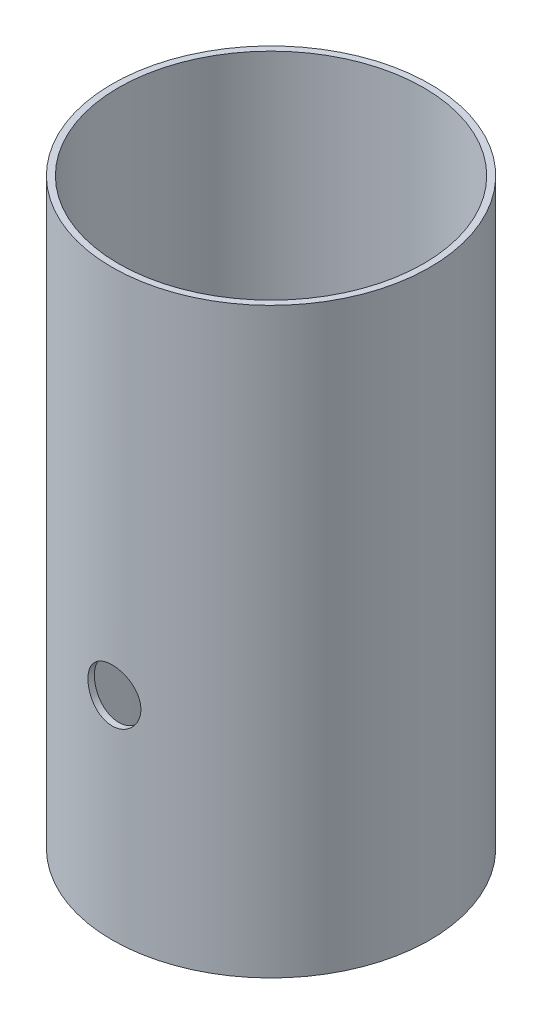
ISO-10303-21;
HEADER;
FILE_DESCRIPTION(('STEP AP214'),'2;1');
FILE_NAME('part.step','',(''),(''),'','','');
FILE_SCHEMA(('AUTOMOTIVE_DESIGN { 1 0 10303 214 1 1 1 1 }'));
ENDSEC;
DATA;
#1=APPLICATION_CONTEXT('core data for automotive mechanical design processes');
#2=APPLICATION_PROTOCOL_DEFINITION('international standard','automotive_design',2000,#1);
#3=PRODUCT_CONTEXT('',#1,'mechanical');
#4=PRODUCT('Part','Part','',(#3));
#5=PRODUCT_RELATED_PRODUCT_CATEGORY('part','',(#4));
#6=PRODUCT_DEFINITION_FORMATION('','',#4);
#7=PRODUCT_DEFINITION_CONTEXT('part definition',#1,'design');
#8=PRODUCT_DEFINITION('design','',#6,#7);
#9=PRODUCT_DEFINITION_SHAPE('','',#8);
#10=(LENGTH_UNIT() NAMED_UNIT(*) SI_UNIT(.MILLI.,.METRE.));
#11=(NAMED_UNIT(*) PLANE_ANGLE_UNIT() SI_UNIT($,.RADIAN.));
#12=(NAMED_UNIT(*) SI_UNIT($,.STERADIAN.) SOLID_ANGLE_UNIT());
#13=UNCERTAINTY_MEASURE_WITH_UNIT(LENGTH_MEASURE(1.E-05),#10,'distance_accuracy_value','');
#14=(GEOMETRIC_REPRESENTATION_CONTEXT(3) GLOBAL_UNCERTAINTY_ASSIGNED_CONTEXT((#13)) GLOBAL_UNIT_ASSIGNED_CONTEXT((#10,
#11,#12)) REPRESENTATION_CONTEXT('',''));
#15=CARTESIAN_POINT('',(0.,0.,0.));
#16=DIRECTION('',(0.,0.,1.));
#17=DIRECTION('',(1.,0.,0.));
#18=AXIS2_PLACEMENT_3D('',#15,#16,#17);
#19=CARTESIAN_POINT('',(0.,69.85,0.));
#20=DIRECTION('',(0.,1.,0.));
#21=DIRECTION('',(0.,0.,1.));
#22=AXIS2_PLACEMENT_3D('',#19,#20,#21);
#23=PLANE('',#22);
#24=CARTESIAN_POINT('',(0.,69.85,0.));
#25=DIRECTION('',(0.,1.,0.));
#26=DIRECTION('',(0.,0.,1.));
#27=AXIS2_PLACEMENT_3D('',#24,#25,#26);
#28=CIRCLE('',#27,38.1);
#29=CARTESIAN_POINT('',(0.,69.85,38.1));
#30=VERTEX_POINT('',#29);
#31=EDGE_CURVE('E10',#30,#30,#28,.T.);
#32=ORIENTED_EDGE('',*,*,#31,.T.);
#33=EDGE_LOOP('',(#32));
#34=FACE_BOUND('',#33,.T.);
#35=CARTESIAN_POINT('',(0.,69.85,0.));
#36=DIRECTION('',(0.,1.,0.));
#37=DIRECTION('',(0.,0.,1.));
#38=AXIS2_PLACEMENT_3D('',#35,#36,#37);
#39=CIRCLE('',#38,36.576);
#40=CARTESIAN_POINT('',(0.,69.85,36.576));
#41=VERTEX_POINT('',#40);
#42=EDGE_CURVE('E52',#41,#41,#39,.T.);
#43=ORIENTED_EDGE('',*,*,#42,.F.);
#44=EDGE_LOOP('',(#43));
#45=FACE_BOUND('',#44,.T.);
#46=ADVANCED_FACE('F33',(#34,#45),#23,.T.);
#47=CARTESIAN_POINT('',(0.,-69.85,0.));
#48=DIRECTION('',(0.,1.,0.));
#49=DIRECTION('',(0.,0.,1.));
#50=AXIS2_PLACEMENT_3D('',#47,#48,#49);
#51=PLANE('',#50);
#52=CARTESIAN_POINT('',(0.,-69.85,0.));
#53=DIRECTION('',(0.,1.,0.));
#54=DIRECTION('',(0.,0.,1.));
#55=AXIS2_PLACEMENT_3D('',#52,#53,#54);
#56=CIRCLE('',#55,38.1);
#57=CARTESIAN_POINT('',(0.,-69.85,38.1));
#58=VERTEX_POINT('',#57);
#59=EDGE_CURVE('E47',#58,#58,#56,.T.);
#60=ORIENTED_EDGE('',*,*,#59,.F.);
#61=EDGE_LOOP('',(#60));
#62=FACE_BOUND('',#61,.T.);
#63=CARTESIAN_POINT('',(0.,-69.85,0.));
#64=DIRECTION('',(0.,1.,0.));
#65=DIRECTION('',(0.,0.,1.));
#66=AXIS2_PLACEMENT_3D('',#63,#64,#65);
#67=CIRCLE('',#66,36.576);
#68=CARTESIAN_POINT('',(0.,-69.85,36.576));
#69=VERTEX_POINT('',#68);
#70=EDGE_CURVE('E54',#69,#69,#67,.T.);
#71=ORIENTED_EDGE('',*,*,#70,.T.);
#72=EDGE_LOOP('',(#71));
#73=FACE_BOUND('',#72,.T.);
#74=ADVANCED_FACE('F86',(#62,#73),#51,.F.);
#75=CARTESIAN_POINT('',(0.,69.85,0.));
#76=DIRECTION('',(0.,-1.,0.));
#77=DIRECTION('',(0.,0.,-1.));
#78=AXIS2_PLACEMENT_3D('',#75,#76,#77);
#79=CYLINDRICAL_SURFACE('',#78,38.1);
#80=CARTESIAN_POINT('',(1.33025439009923E-13,-25.4,38.1));
#81=CARTESIAN_POINT('',(-0.177087187489145,-25.4000027287258,38.1000011863187));
#82=CARTESIAN_POINT('',(-0.354137436243976,-25.3925898603264,38.0987630708564));
#83=CARTESIAN_POINT('',(-0.707020298098903,-25.3629995869518,38.0938477536353));
#84=CARTESIAN_POINT('',(-0.882852663182084,-25.3408192590726,38.0901700690163));
#85=CARTESIAN_POINT('',(-1.23209116083694,-25.2818407076195,38.0804739658059));
#86=CARTESIAN_POINT('',(-1.40549569131957,-25.245033262777,38.0744540706817));
#87=CARTESIAN_POINT('',(-1.74860263812462,-25.1570667096346,38.0602401477359));
#88=CARTESIAN_POINT('',(-1.91830367136924,-25.1059023353182,38.0520453222257));
#89=CARTESIAN_POINT('',(-2.25254220668827,-24.9896820482716,38.0337223659018));
#90=CARTESIAN_POINT('',(-2.41708564982875,-24.9246428472392,38.0235965624201));
#91=CARTESIAN_POINT('',(-2.74014193111749,-24.781088654165,38.0016821525234));
#92=CARTESIAN_POINT('',(-2.89865252044285,-24.7025686959559,37.98989293361));
#93=CARTESIAN_POINT('',(-3.20841653485792,-24.5326774872742,37.9649864854272));
#94=CARTESIAN_POINT('',(-3.35967352134198,-24.4413126318839,37.9518699179092));
#95=CARTESIAN_POINT('',(-3.65404496448413,-24.246310000523,37.9246597405347));
#96=CARTESIAN_POINT('',(-3.79715636428482,-24.1426676614611,37.9105657682245));
#97=CARTESIAN_POINT('',(-4.0753480890674,-23.9229570413913,37.8816744348182));
#98=CARTESIAN_POINT('',(-4.21035302453195,-23.8067939276504,37.8668722576236));
#99=CARTESIAN_POINT('',(-4.47017019453277,-23.5635090149652,37.8370808534962));
#100=CARTESIAN_POINT('',(-4.59497863698438,-23.436383174777,37.822091559342));
#101=CARTESIAN_POINT('',(-4.83345363594841,-23.1721222684757,37.7923559025336));
#102=CARTESIAN_POINT('',(-4.94712356668836,-23.0349902556656,37.7776094674423));
#103=CARTESIAN_POINT('',(-5.16261513533878,-22.7515683619107,37.7487646238876));
#104=CARTESIAN_POINT('',(-5.2644323879165,-22.6052751220277,37.7346664564344));
#105=CARTESIAN_POINT('',(-5.45600638335973,-22.3037037728606,37.7074450790141));
#106=CARTESIAN_POINT('',(-5.54568970289734,-22.1483784466417,37.6943280021243));
#107=CARTESIAN_POINT('',(-5.7116713759196,-21.8305518599543,37.6695348337581));
#108=CARTESIAN_POINT('',(-5.78796472928619,-21.6680479470714,37.6578592810601));
#109=CARTESIAN_POINT('',(-5.92652810622992,-21.3371184750125,37.6363015667466));
#110=CARTESIAN_POINT('',(-5.98880405333028,-21.1686954520726,37.6264186479379));
#111=CARTESIAN_POINT('',(-6.09891747906039,-20.8270699666389,37.6087259862464));
#112=CARTESIAN_POINT('',(-6.1467496861929,-20.6538657842871,37.600917000407));
#113=CARTESIAN_POINT('',(-6.26716384053562,-20.1322921256618,37.5811069534251));
#114=CARTESIAN_POINT('',(-6.31810213845194,-19.7785115409901,37.5724910212384));
#115=CARTESIAN_POINT('',(-6.35996687648422,-19.0675219888653,37.5654259452238));
#116=CARTESIAN_POINT('',(-6.35089756366365,-18.710313265827,37.5669760818881));
#117=CARTESIAN_POINT('',(-6.27352869541662,-18.0062575122119,37.5799723761781));
#118=CARTESIAN_POINT('',(-6.20584069900653,-17.6593416259506,37.5913163525529));
#119=CARTESIAN_POINT('',(-6.0140942776626,-16.9818740256272,37.6224668880973));
#120=CARTESIAN_POINT('',(-5.89003391937069,-16.6513228732446,37.6422737375101));
#121=CARTESIAN_POINT('',(-5.58844985400091,-16.0141198211769,37.6882274534117));
#122=CARTESIAN_POINT('',(-5.41067212714122,-15.7075903853928,37.7144043255227));
#123=CARTESIAN_POINT('',(-5.00687861871646,-15.1284825457711,37.7701281067429));
#124=CARTESIAN_POINT('',(-4.78085894382563,-14.8559068849576,37.7996752877603));
#125=CARTESIAN_POINT('',(-4.28366479320567,-14.3489018175807,37.8592595138753));
#126=CARTESIAN_POINT('',(-4.01196546135631,-14.11498698314,37.8892980920187));
#127=CARTESIAN_POINT('',(-3.43289953929458,-13.6959904625981,37.946142073942));
#128=CARTESIAN_POINT('',(-3.12553271928909,-13.5109090911389,37.9729474568892));
#129=CARTESIAN_POINT('',(-2.48337302521484,-13.1947863484741,38.0203428798906));
#130=CARTESIAN_POINT('',(-2.14855736243002,-13.0637904362427,38.0409276876551));
#131=CARTESIAN_POINT('',(-1.46125779833485,-12.8600346919313,38.0735205764156));
#132=CARTESIAN_POINT('',(-1.10877537768365,-12.7872699881105,38.0855293748888));
#133=CARTESIAN_POINT('',(-0.400583149140021,-12.7027397494853,38.0995206980173));
#134=CARTESIAN_POINT('',(-0.0449598721957369,-12.690267806208,38.1016193264734));
#135=CARTESIAN_POINT('',(0.663295022972759,-12.7247938162532,38.0958718503491));
#136=CARTESIAN_POINT('',(1.01592675578112,-12.7717894813591,38.0880261284112));
#137=CARTESIAN_POINT('',(1.70600668639066,-12.9233291117466,38.063343404013));
#138=CARTESIAN_POINT('',(2.04353380753423,-13.0275233485048,38.0465610611375));
#139=CARTESIAN_POINT('',(2.69632908571033,-13.2901296970341,38.0058793979819));
#140=CARTESIAN_POINT('',(3.01159599157109,-13.4485448534589,37.9819796780514));
#141=CARTESIAN_POINT('',(3.61398995815146,-13.8167137783783,37.9294267110081));
#142=CARTESIAN_POINT('',(3.9008437632352,-14.0269088030505,37.9007333280144));
#143=CARTESIAN_POINT('',(4.43545868132037,-14.4920650747137,37.841897083271));
#144=CARTESIAN_POINT('',(4.68321695230051,-14.7470295733451,37.8117541163526));
#145=CARTESIAN_POINT('',(5.13522675786035,-15.2976506645233,37.7530404075497));
#146=CARTESIAN_POINT('',(5.33900101897007,-15.593701426898,37.7244891869762));
#147=CARTESIAN_POINT('',(5.69392350241989,-16.2162606949888,37.6725570192594));
#148=CARTESIAN_POINT('',(5.84507339294333,-16.5427682348142,37.6491759082332));
#149=CARTESIAN_POINT('',(6.08974872162501,-17.2155704802361,37.6103751182998));
#150=CARTESIAN_POINT('',(6.18351170337922,-17.5617770444821,37.5949226636084));
#151=CARTESIAN_POINT('',(6.31147698831468,-18.2655026400544,37.5736562611202));
#152=CARTESIAN_POINT('',(6.34568446957225,-18.6230206851474,37.5678414753746));
#153=CARTESIAN_POINT('',(6.35156479805339,-19.1572004249436,37.5668394538809));
#154=CARTESIAN_POINT('',(6.34611349252073,-19.3338918909742,37.5677648877223));
#155=CARTESIAN_POINT('',(6.32051614738178,-19.686158982299,37.5720813559984));
#156=CARTESIAN_POINT('',(6.30037562911692,-19.8617350018585,37.5754714640165));
#157=CARTESIAN_POINT('',(6.24553793473028,-20.2105866923811,37.5846246847688));
#158=CARTESIAN_POINT('',(6.21083556002659,-20.3838615190051,37.5903886449545));
#159=CARTESIAN_POINT('',(6.12715693228844,-20.7267764976905,37.604118742639));
#160=CARTESIAN_POINT('',(6.07818581742773,-20.8964179345707,37.6120840873661));
#161=CARTESIAN_POINT('',(5.96637654372844,-21.2308041285048,37.6299820560965));
#162=CARTESIAN_POINT('',(5.90354973294356,-21.3955527682721,37.6399130695048));
#163=CARTESIAN_POINT('',(5.7644917307722,-21.7191065825765,37.6614601477676));
#164=CARTESIAN_POINT('',(5.68826534098607,-21.877913861498,37.6730756087576));
#165=CARTESIAN_POINT('',(5.52290613124242,-22.1886290425153,37.6976722605729));
#166=CARTESIAN_POINT('',(5.43376825184764,-22.3405342091843,37.7106539862286));
#167=CARTESIAN_POINT('',(5.24326758944346,-22.6363041375522,37.7376124328875));
#168=CARTESIAN_POINT('',(5.14190910346808,-22.7801716995618,37.7515888034474));
#169=CARTESIAN_POINT('',(4.92632600417368,-23.0606710473517,37.7803292409247));
#170=CARTESIAN_POINT('',(4.81195911510507,-23.1971927344323,37.7951008544654));
#171=CARTESIAN_POINT('',(4.57222320121736,-23.4600920135284,37.824851025054));
#172=CARTESIAN_POINT('',(4.44685811987946,-23.5864732106223,37.8398295063179));
#173=CARTESIAN_POINT('',(4.18587205978377,-23.8283520510713,37.869588465624));
#174=CARTESIAN_POINT('',(4.05024500803624,-23.9438431574696,37.8843688202287));
#175=CARTESIAN_POINT('',(3.76978048024312,-24.1630145594532,37.9133039762987));
#176=CARTESIAN_POINT('',(3.62494642226602,-24.2666991987049,37.9274590066437));
#177=CARTESIAN_POINT('',(3.32592456844769,-24.4622891886215,37.9548537782111));
#178=CARTESIAN_POINT('',(3.17167621480008,-24.554103036644,37.9680860844735));
#179=CARTESIAN_POINT('',(2.85593164400648,-24.7243558689261,37.9931404953123));
#180=CARTESIAN_POINT('',(2.69443812110219,-24.8027997737991,38.0049631182187));
#181=CARTESIAN_POINT('',(2.36539813222977,-24.9457218969604,38.026859543709));
#182=CARTESIAN_POINT('',(2.19785596261672,-25.0102098090139,38.0369345592008));
#183=CARTESIAN_POINT('',(1.85787010097697,-25.1247844199971,38.05505638655));
#184=CARTESIAN_POINT('',(1.68542746934939,-25.1748742088173,38.0631036335282));
#185=CARTESIAN_POINT('',(1.26427501955255,-25.278052442486,38.0798175597504));
#186=CARTESIAN_POINT('',(1.01366559672319,-25.3237284444303,38.0873506266375));
#187=CARTESIAN_POINT('',(0.508678681414495,-25.3847000024044,38.0974409521383));
#188=CARTESIAN_POINT('',(0.254301253885114,-25.3999960814873,38.0999982964192));
#189=CARTESIAN_POINT('',(1.33025439009923E-13,-25.4,38.1));
#190=B_SPLINE_CURVE_WITH_KNOTS('',3,(#80,#81,#82,#83,#84,#85,#86,#87,#88,#89,#90,#91,#92,#93,
#94,#95,#96,#97,#98,#99,#100,#101,#102,#103,#104,#105,#106,#107,#108,#109,#110,#111,#112,#113,
#114,#115,#116,#117,#118,#119,#120,#121,#122,#123,#124,#125,#126,#127,#128,#129,#130,#131,#132,
#133,#134,#135,#136,#137,#138,#139,#140,#141,#142,#143,#144,#145,#146,#147,#148,#149,#150,#151,
#152,#153,#154,#155,#156,#157,#158,#159,#160,#161,#162,#163,#164,#165,#166,#167,#168,#169,#170,
#171,#172,#173,#174,#175,#176,#177,#178,#179,#180,#181,#182,#183,#184,#185,#186,#187,#188,#189),
.UNSPECIFIED.,.T.,.F.,(4,2,2,2,2,2,2,2,2,2,2,2,2,2,2,2,2,2,2,2,2,2,2,2,2,2,2,2,2,2,2,2,2,2,2,2,
2,2,2,2,2,2,2,2,2,2,2,2,2,2,2,2,2,2,4),(0.,0.531038660598125,1.06218246024441,1.59366163761647,
2.12533601304965,2.6563735866145,3.1876072101753,3.71857727922958,4.24974531326047,
4.78526441519897,5.3209817790362,5.85653635119168,6.3922884458258,6.93114981384536,
7.47021197879169,8.00904591554079,8.54807627219621,9.61504645798446,10.6819411293246,
11.7378373522885,12.7937697912188,13.8547758380411,14.9158675448607,15.9901084553218,
17.0643562871247,18.1395051980381,19.2145641504113,20.2769963402556,21.339387650685,
22.3953543975371,23.4513804495562,24.5167374705005,25.5821719011529,26.6586431785677,
27.7350803289231,28.807031067069,29.8788885993829,30.4087059677912,30.9383242924513,
31.4681318518971,31.9977488629147,32.5269337088015,33.0559293119034,33.5851327684116,
34.1141506850706,34.6496427436839,35.1849435764207,35.720563713634,36.2559861520879,
36.795316710381,37.3344483452647,37.8732042913802,38.4118445320141,39.1744413312763,
39.9370250007452),.UNSPECIFIED.);
#191=CARTESIAN_POINT('',(1.33025439009923E-13,-25.4,38.1));
#192=VERTEX_POINT('',#191);
#193=EDGE_CURVE('E65',#192,#192,#190,.T.);
#194=ORIENTED_EDGE('',*,*,#193,.T.);
#195=EDGE_LOOP('',(#194));
#196=FACE_BOUND('',#195,.T.);
#197=CARTESIAN_POINT('',(-38.1,-25.4,0.));
#198=CARTESIAN_POINT('',(-38.1000011863187,-25.4000027287258,-0.177087187489278));
#199=CARTESIAN_POINT('',(-38.0987630708564,-25.3925898603264,-0.354137436244109));
#200=CARTESIAN_POINT('',(-38.0938477536353,-25.3629995869518,-0.707020298099037));
#201=CARTESIAN_POINT('',(-38.0901700690163,-25.3408192590726,-0.882852663182217));
#202=CARTESIAN_POINT('',(-38.0804739658059,-25.2818407076195,-1.23209116083708));
#203=CARTESIAN_POINT('',(-38.0744540706817,-25.245033262777,-1.4054956913197));
#204=CARTESIAN_POINT('',(-38.0602401477359,-25.1570667096346,-1.74860263812475));
#205=CARTESIAN_POINT('',(-38.0520453222257,-25.1059023353182,-1.91830367136937));
#206=CARTESIAN_POINT('',(-38.0337223659018,-24.9896820482716,-2.25254220668841));
#207=CARTESIAN_POINT('',(-38.0235965624201,-24.9246428472392,-2.41708564982888));
#208=CARTESIAN_POINT('',(-38.0016821525234,-24.781088654165,-2.74014193111762));
#209=CARTESIAN_POINT('',(-37.98989293361,-24.7025686959559,-2.89865252044299));
#210=CARTESIAN_POINT('',(-37.9649864854272,-24.5326774872742,-3.20841653485805));
#211=CARTESIAN_POINT('',(-37.9518699179091,-24.4413126318839,-3.35967352134212));
#212=CARTESIAN_POINT('',(-37.9246597405346,-24.246310000523,-3.65404496448427));
#213=CARTESIAN_POINT('',(-37.9105657682245,-24.1426676614611,-3.79715636428495));
#214=CARTESIAN_POINT('',(-37.8816744348182,-23.9229570413913,-4.07534808906753));
#215=CARTESIAN_POINT('',(-37.8668722576236,-23.8067939276504,-4.21035302453209));
#216=CARTESIAN_POINT('',(-37.8370808534961,-23.5635090149652,-4.47017019453291));
#217=CARTESIAN_POINT('',(-37.822091559342,-23.436383174777,-4.59497863698451));
#218=CARTESIAN_POINT('',(-37.7923559025335,-23.1721222684757,-4.83345363594854));
#219=CARTESIAN_POINT('',(-37.7776094674422,-23.0349902556656,-4.94712356668848));
#220=CARTESIAN_POINT('',(-37.7487646238876,-22.7515683619107,-5.16261513533891));
#221=CARTESIAN_POINT('',(-37.7346664564344,-22.6052751220277,-5.26443238791663));
#222=CARTESIAN_POINT('',(-37.7074450790141,-22.3037037728606,-5.45600638335987));
#223=CARTESIAN_POINT('',(-37.6943280021243,-22.1483784466417,-5.54568970289747));
#224=CARTESIAN_POINT('',(-37.6695348337581,-21.8305518599543,-5.71167137591973));
#225=CARTESIAN_POINT('',(-37.6578592810601,-21.6680479470714,-5.78796472928633));
#226=CARTESIAN_POINT('',(-37.6363015667466,-21.3371184750125,-5.92652810623005));
#227=CARTESIAN_POINT('',(-37.6264186479379,-21.1686954520726,-5.98880405333041));
#228=CARTESIAN_POINT('',(-37.6087259862464,-20.8270699666389,-6.09891747906052));
#229=CARTESIAN_POINT('',(-37.600917000407,-20.6538657842871,-6.14674968619303));
#230=CARTESIAN_POINT('',(-37.581106953425,-20.1322921256618,-6.26716384053575));
#231=CARTESIAN_POINT('',(-37.5724910212383,-19.7785115409901,-6.31810213845207));
#232=CARTESIAN_POINT('',(-37.5654259452238,-19.0675219888653,-6.35996687648436));
#233=CARTESIAN_POINT('',(-37.5669760818881,-18.710313265827,-6.35089756366378));
#234=CARTESIAN_POINT('',(-37.5799723761781,-18.0062575122119,-6.27352869541675));
#235=CARTESIAN_POINT('',(-37.5913163525528,-17.6593416259506,-6.20584069900666));
#236=CARTESIAN_POINT('',(-37.6224668880973,-16.9818740256272,-6.01409427766273));
#237=CARTESIAN_POINT('',(-37.6422737375101,-16.6513228732446,-5.89003391937083));
#238=CARTESIAN_POINT('',(-37.6882274534117,-16.0141198211769,-5.58844985400104));
#239=CARTESIAN_POINT('',(-37.7144043255227,-15.7075903853928,-5.41067212714135));
#240=CARTESIAN_POINT('',(-37.7701281067429,-15.1284825457711,-5.00687861871659));
#241=CARTESIAN_POINT('',(-37.7996752877603,-14.8559068849576,-4.78085894382576));
#242=CARTESIAN_POINT('',(-37.8592595138752,-14.3489018175807,-4.2836647932058));
#243=CARTESIAN_POINT('',(-37.8892980920187,-14.11498698314,-4.01196546135644));
#244=CARTESIAN_POINT('',(-37.946142073942,-13.6959904625981,-3.43289953929472));
#245=CARTESIAN_POINT('',(-37.9729474568892,-13.5109090911389,-3.12553271928923));
#246=CARTESIAN_POINT('',(-38.0203428798906,-13.1947863484741,-2.48337302521498));
#247=CARTESIAN_POINT('',(-38.0409276876551,-13.0637904362427,-2.14855736243015));
#248=CARTESIAN_POINT('',(-38.0735205764156,-12.8600346919313,-1.46125779833498));
#249=CARTESIAN_POINT('',(-38.0855293748888,-12.7872699881105,-1.10877537768379));
#250=CARTESIAN_POINT('',(-38.0995206980173,-12.7027397494853,-0.400583149140154));
#251=CARTESIAN_POINT('',(-38.1016193264734,-12.690267806208,-0.0449598721958701));
#252=CARTESIAN_POINT('',(-38.0958718503491,-12.7247938162532,0.663295022972626));
#253=CARTESIAN_POINT('',(-38.0880261284112,-12.7717894813591,1.01592675578099));
#254=CARTESIAN_POINT('',(-38.063343404013,-12.9233291117466,1.70600668639052));
#255=CARTESIAN_POINT('',(-38.0465610611375,-13.0275233485048,2.0435338075341));
#256=CARTESIAN_POINT('',(-38.0058793979819,-13.2901296970341,2.6963290857102));
#257=CARTESIAN_POINT('',(-37.9819796780514,-13.4485448534589,3.01159599157095));
#258=CARTESIAN_POINT('',(-37.9294267110082,-13.8167137783783,3.61398995815133));
#259=CARTESIAN_POINT('',(-37.9007333280144,-14.0269088030505,3.90084376323507));
#260=CARTESIAN_POINT('',(-37.8418970832711,-14.4920650747137,4.43545868132024));
#261=CARTESIAN_POINT('',(-37.8117541163526,-14.7470295733451,4.68321695230038));
#262=CARTESIAN_POINT('',(-37.7530404075497,-15.2976506645233,5.13522675786021));
#263=CARTESIAN_POINT('',(-37.7244891869762,-15.593701426898,5.33900101896994));
#264=CARTESIAN_POINT('',(-37.6725570192594,-16.2162606949888,5.69392350241975));
#265=CARTESIAN_POINT('',(-37.6491759082333,-16.5427682348142,5.8450733929432));
#266=CARTESIAN_POINT('',(-37.6103751182998,-17.2155704802361,6.08974872162488));
#267=CARTESIAN_POINT('',(-37.5949226636084,-17.5617770444821,6.18351170337909));
#268=CARTESIAN_POINT('',(-37.5736562611202,-18.2655026400544,6.31147698831455));
#269=CARTESIAN_POINT('',(-37.5678414753746,-18.6230206851474,6.34568446957212));
#270=CARTESIAN_POINT('',(-37.566839453881,-19.1572004249436,6.35156479805326));
#271=CARTESIAN_POINT('',(-37.5677648877224,-19.3338918909742,6.3461134925206));
#272=CARTESIAN_POINT('',(-37.5720813559984,-19.686158982299,6.32051614738165));
#273=CARTESIAN_POINT('',(-37.5754714640165,-19.8617350018585,6.30037562911679));
#274=CARTESIAN_POINT('',(-37.5846246847688,-20.2105866923811,6.24553793473014));
#275=CARTESIAN_POINT('',(-37.5903886449545,-20.3838615190051,6.21083556002646));
#276=CARTESIAN_POINT('',(-37.604118742639,-20.7267764976905,6.1271569322883));
#277=CARTESIAN_POINT('',(-37.6120840873662,-20.8964179345707,6.0781858174276));
#278=CARTESIAN_POINT('',(-37.6299820560965,-21.2308041285048,5.96637654372831));
#279=CARTESIAN_POINT('',(-37.6399130695049,-21.3955527682721,5.90354973294343));
#280=CARTESIAN_POINT('',(-37.6614601477677,-21.7191065825765,5.76449173077206));
#281=CARTESIAN_POINT('',(-37.6730756087577,-21.877913861498,5.68826534098594));
#282=CARTESIAN_POINT('',(-37.6976722605729,-22.1886290425153,5.52290613124229));
#283=CARTESIAN_POINT('',(-37.7106539862286,-22.3405342091843,5.43376825184751));
#284=CARTESIAN_POINT('',(-37.7376124328875,-22.6363041375522,5.24326758944333));
#285=CARTESIAN_POINT('',(-37.7515888034474,-22.7801716995618,5.14190910346795));
#286=CARTESIAN_POINT('',(-37.7803292409247,-23.0606710473517,4.92632600417355));
#287=CARTESIAN_POINT('',(-37.7951008544654,-23.1971927344322,4.81195911510494));
#288=CARTESIAN_POINT('',(-37.824851025054,-23.4600920135284,4.57222320121723));
#289=CARTESIAN_POINT('',(-37.8398295063179,-23.5864732106223,4.44685811987933));
#290=CARTESIAN_POINT('',(-37.869588465624,-23.8283520510713,4.18587205978364));
#291=CARTESIAN_POINT('',(-37.8843688202287,-23.9438431574696,4.05024500803611));
#292=CARTESIAN_POINT('',(-37.9133039762987,-24.1630145594532,3.76978048024299));
#293=CARTESIAN_POINT('',(-37.9274590066437,-24.2666991987049,3.62494642226589));
#294=CARTESIAN_POINT('',(-37.9548537782111,-24.4622891886215,3.32592456844756));
#295=CARTESIAN_POINT('',(-37.9680860844735,-24.554103036644,3.17167621479994));
#296=CARTESIAN_POINT('',(-37.9931404953123,-24.7243558689261,2.85593164400635));
#297=CARTESIAN_POINT('',(-38.0049631182187,-24.8027997737991,2.69443812110206));
#298=CARTESIAN_POINT('',(-38.026859543709,-24.9457218969604,2.36539813222963));
#299=CARTESIAN_POINT('',(-38.0369345592008,-25.0102098090139,2.19785596261659));
#300=CARTESIAN_POINT('',(-38.05505638655,-25.1247844199971,1.85787010097684));
#301=CARTESIAN_POINT('',(-38.0631036335282,-25.1748742088173,1.68542746934925));
#302=CARTESIAN_POINT('',(-38.0798175597504,-25.278052442486,1.26427501955242));
#303=CARTESIAN_POINT('',(-38.0873506266376,-25.3237284444303,1.01366559672306));
#304=CARTESIAN_POINT('',(-38.0974409521383,-25.3847000024044,0.508678681414362));
#305=CARTESIAN_POINT('',(-38.0999982964193,-25.3999960814873,0.254301253884981));
#306=CARTESIAN_POINT('',(-38.1,-25.4,0.));
#307=B_SPLINE_CURVE_WITH_KNOTS('',3,(#197,#198,#199,#200,#201,#202,#203,#204,#205,#206,#207,
#208,#209,#210,#211,#212,#213,#214,#215,#216,#217,#218,#219,#220,#221,#222,#223,#224,#225,#226,
#227,#228,#229,#230,#231,#232,#233,#234,#235,#236,#237,#238,#239,#240,#241,#242,#243,#244,#245,
#246,#247,#248,#249,#250,#251,#252,#253,#254,#255,#256,#257,#258,#259,#260,#261,#262,#263,#264,
#265,#266,#267,#268,#269,#270,#271,#272,#273,#274,#275,#276,#277,#278,#279,#280,#281,#282,#283,
#284,#285,#286,#287,#288,#289,#290,#291,#292,#293,#294,#295,#296,#297,#298,#299,#300,#301,#302,
#303,#304,#305,#306),.UNSPECIFIED.,.T.,.F.,(4,2,2,2,2,2,2,2,2,2,2,2,2,2,2,2,2,2,2,2,2,2,2,2,2,2,
2,2,2,2,2,2,2,2,2,2,2,2,2,2,2,2,2,2,2,2,2,2,2,2,2,2,2,2,4),(0.,0.531038660598125,
1.06218246024441,1.59366163761647,2.12533601304965,2.6563735866145,3.1876072101753,
3.71857727922958,4.24974531326047,4.78526441519898,5.3209817790362,5.85653635119168,
6.3922884458258,6.93114981384536,7.47021197879169,8.00904591554079,8.54807627219621,
9.61504645798446,10.6819411293246,11.7378373522885,12.7937697912188,13.8547758380411,
14.9158675448607,15.9901084553218,17.0643562871247,18.1395051980381,19.2145641504113,
20.2769963402556,21.339387650685,22.3953543975371,23.4513804495562,24.5167374705005,
25.5821719011529,26.6586431785677,27.7350803289231,28.807031067069,29.8788885993829,
30.4087059677912,30.9383242924513,31.4681318518971,31.9977488629147,32.5269337088015,
33.0559293119034,33.5851327684116,34.1141506850706,34.6496427436838,35.1849435764207,
35.720563713634,36.2559861520879,36.7953167103811,37.3344483452647,37.8732042913803,
38.4118445320141,39.1744413312763,39.9370250007452),.UNSPECIFIED.);
#308=CARTESIAN_POINT('',(-38.1,-25.4,0.));
#309=VERTEX_POINT('',#308);
#310=EDGE_CURVE('E57',#309,#309,#307,.T.);
#311=ORIENTED_EDGE('',*,*,#310,.T.);
#312=EDGE_LOOP('',(#311));
#313=FACE_BOUND('',#312,.T.);
#314=ORIENTED_EDGE('',*,*,#31,.F.);
#315=EDGE_LOOP('',(#314));
#316=FACE_BOUND('',#315,.T.);
#317=ORIENTED_EDGE('',*,*,#59,.T.);
#318=EDGE_LOOP('',(#317));
#319=FACE_BOUND('',#318,.T.);
#320=ADVANCED_FACE('F35',(#196,#313,#316,#319),#79,.T.);
#321=CARTESIAN_POINT('',(0.,69.85,0.));
#322=DIRECTION('',(0.,-1.,0.));
#323=DIRECTION('',(0.,0.,-1.));
#324=AXIS2_PLACEMENT_3D('',#321,#322,#323);
#325=CYLINDRICAL_SURFACE('',#324,36.576);
#326=CARTESIAN_POINT('',(-6.34999999999987,-19.05,36.0205674025272));
#327=CARTESIAN_POINT('',(-6.35000287917337,-18.8730462785967,36.0205660344902));
#328=CARTESIAN_POINT('',(-6.34260108418973,-18.6961308701325,36.0218738644585));
#329=CARTESIAN_POINT('',(-6.31305605934268,-18.3435190648478,36.0270639922127));
#330=CARTESIAN_POINT('',(-6.29090999122799,-18.1678229093126,36.0309467856747));
#331=CARTESIAN_POINT('',(-6.23202492880654,-17.8188619206529,36.041178234899));
#332=CARTESIAN_POINT('',(-6.19527701568375,-17.6455986406205,36.0475283976793));
#333=CARTESIAN_POINT('',(-6.10745623523989,-17.3027740718346,36.0625115313081));
#334=CARTESIAN_POINT('',(-6.05637810541804,-17.1332141677782,36.0711453407159));
#335=CARTESIAN_POINT('',(-5.94036117192468,-16.7992629759874,36.0904327374134));
#336=CARTESIAN_POINT('',(-5.87543974263709,-16.6348655030266,36.1010837910533));
#337=CARTESIAN_POINT('',(-5.7321508866451,-16.312092697475,36.1241122542644));
#338=CARTESIAN_POINT('',(-5.65377850313127,-16.1537196113075,36.1364902999334));
#339=CARTESIAN_POINT('',(-5.48421002074647,-15.8442142100176,36.1626128457137));
#340=CARTESIAN_POINT('',(-5.39302015211223,-15.6930784246051,36.1763566810059));
#341=CARTESIAN_POINT('',(-5.19839316136283,-15.3989287081152,36.2048360973937));
#342=CARTESIAN_POINT('',(-5.09495148149173,-15.2559178290162,36.2195720466772));
#343=CARTESIAN_POINT('',(-4.87555457022379,-14.9777608134449,36.2497601844259));
#344=CARTESIAN_POINT('',(-4.75949292729651,-14.8426991787565,36.2652177168094));
#345=CARTESIAN_POINT('',(-4.51640601347824,-14.5827576721701,36.2962927611376));
#346=CARTESIAN_POINT('',(-4.38937669834124,-14.45788158941,36.3119103302076));
#347=CARTESIAN_POINT('',(-4.12530040019857,-14.2192592950773,36.342858116078));
#348=CARTESIAN_POINT('',(-3.9882564863667,-14.1055096983555,36.3581884191221));
#349=CARTESIAN_POINT('',(-3.70499888671006,-13.8898467270639,36.3881443115805));
#350=CARTESIAN_POINT('',(-3.55878183927634,-13.7879377311099,36.4027696391346));
#351=CARTESIAN_POINT('',(-3.2572972131388,-13.596136386464,36.4309874458842));
#352=CARTESIAN_POINT('',(-3.10197954481413,-13.5063217198646,36.4445730267261));
#353=CARTESIAN_POINT('',(-2.78414695277741,-13.340078195583,36.4702308121557));
#354=CARTESIAN_POINT('',(-2.62162936676239,-13.2636543420418,36.4823024505067));
#355=CARTESIAN_POINT('',(-2.29065205752653,-13.124834601287,36.5045771599492));
#356=CARTESIAN_POINT('',(-2.12219489305343,-13.0624327568412,36.514781024219));
#357=CARTESIAN_POINT('',(-1.78048204277313,-12.9520754129981,36.5330404135826));
#358=CARTESIAN_POINT('',(-1.6072246312401,-12.9041251846275,36.5410951546908));
#359=CARTESIAN_POINT('',(-1.08574640736195,-12.7834403784384,36.561516018496));
#360=CARTESIAN_POINT('',(-0.732101615254544,-12.7323186652905,36.5703963763251));
#361=CARTESIAN_POINT('',(-0.0213445275521355,-12.6900506852474,36.5777233731121));
#362=CARTESIAN_POINT('',(0.335767511294379,-12.6989000108333,36.5761707788307));
#363=CARTESIAN_POINT('',(1.03950848280449,-12.775782887452,36.5629004152224));
#364=CARTESIAN_POINT('',(1.38620882321105,-12.8431795425977,36.5512920395962));
#365=CARTESIAN_POINT('',(2.06328988854346,-13.034261042927,36.5193317613508));
#366=CARTESIAN_POINT('',(2.39367008352133,-13.1579477146307,36.4989795750102));
#367=CARTESIAN_POINT('',(3.03062891539939,-13.4587172576495,36.4516344580681));
#368=CARTESIAN_POINT('',(3.33708231304048,-13.6360601109501,36.4246093147401));
#369=CARTESIAN_POINT('',(3.91611915324724,-14.0389186183746,36.3669161023735));
#370=CARTESIAN_POINT('',(4.18869962438743,-14.2644384940066,36.3362477142005));
#371=CARTESIAN_POINT('',(4.69602184268724,-14.7607752476102,36.2741981115193));
#372=CARTESIAN_POINT('',(4.93021846872576,-15.0321491392999,36.2428128274487));
#373=CARTESIAN_POINT('',(5.34984573222437,-15.6106208103155,36.1832555741439));
#374=CARTESIAN_POINT('',(5.53527584241167,-15.9177189758472,36.1550836396549));
#375=CARTESIAN_POINT('',(5.85222897780605,-16.5595829048307,36.1051394318752));
#376=CARTESIAN_POINT('',(5.98368202990364,-16.8943839099113,36.0833754758326));
#377=CARTESIAN_POINT('',(6.18832700618279,-17.5817788930152,36.0488454817896));
#378=CARTESIAN_POINT('',(6.26152452646524,-17.9343711585262,36.0360785795342));
#379=CARTESIAN_POINT('',(6.34680399898853,-18.6424501934235,36.0211566952906));
#380=CARTESIAN_POINT('',(6.3596649823436,-18.9978403768274,36.0188664542969));
#381=CARTESIAN_POINT('',(6.32598623921524,-19.7056934546484,36.0247963973786));
#382=CARTESIAN_POINT('',(6.27944901145251,-20.0581564715758,36.0330161393278));
#383=CARTESIAN_POINT('',(6.12896059111814,-20.7476478245133,36.058914592269));
#384=CARTESIAN_POINT('',(6.02540972602777,-21.0847662346971,36.0765273226081));
#385=CARTESIAN_POINT('',(5.76425479057914,-21.736865960686,36.1191714047353));
#386=CARTESIAN_POINT('',(5.60664724155245,-22.0518458502556,36.1442032339448));
#387=CARTESIAN_POINT('',(5.24002924313716,-22.6541833298029,36.1991773484221));
#388=CARTESIAN_POINT('',(5.03052184650969,-22.9412341271908,36.2291661143274));
#389=CARTESIAN_POINT('',(4.56672823607228,-23.4763851749098,36.2905408272434));
#390=CARTESIAN_POINT('',(4.31243859352641,-23.724482440025,36.3219268810995));
#391=CARTESIAN_POINT('',(3.76284315502642,-24.1775500348406,36.3829899767281));
#392=CARTESIAN_POINT('',(3.46710494375588,-24.3819994110207,36.4126436026989));
#393=CARTESIAN_POINT('',(2.84501190863207,-24.7383082455254,36.4665186104641));
#394=CARTESIAN_POINT('',(2.51865813920917,-24.8901695141924,36.4907401792465));
#395=CARTESIAN_POINT('',(1.84617858793503,-25.1361963398305,36.5309230908333));
#396=CARTESIAN_POINT('',(1.50015268735267,-25.2306290803784,36.5469226314737));
#397=CARTESIAN_POINT('',(0.796653256995824,-25.359954672728,36.5690112443355));
#398=CARTESIAN_POINT('',(0.439180755822717,-25.3948528591448,36.5751012045061));
#399=CARTESIAN_POINT('',(-0.0949023473916739,-25.4017575232442,36.5763076970292));
#400=CARTESIAN_POINT('',(-0.271497656448819,-25.3966528646731,36.5754176833037));
#401=CARTESIAN_POINT('',(-0.623601823273815,-25.3717644384247,36.5711058226247));
#402=CARTESIAN_POINT('',(-0.799111064818115,-25.3519861944648,36.567684928396));
#403=CARTESIAN_POINT('',(-1.14785799159299,-25.2978867734293,36.55840081073));
#404=CARTESIAN_POINT('',(-1.32109485122848,-25.2635604538476,36.5525367236766));
#405=CARTESIAN_POINT('',(-1.66396342647992,-25.1806457614853,36.538533394963));
#406=CARTESIAN_POINT('',(-1.83359641551561,-25.1320625193624,36.5303949718213));
#407=CARTESIAN_POINT('',(-2.16797086832116,-25.0210474236102,36.5120759836964));
#408=CARTESIAN_POINT('',(-2.3327168826,-24.9586289429487,36.501897391618));
#409=CARTESIAN_POINT('',(-2.65629772946788,-24.8204006915962,36.4797772754008));
#410=CARTESIAN_POINT('',(-2.81513465180815,-24.7445957106086,36.4678363820653));
#411=CARTESIAN_POINT('',(-3.12594353604344,-24.5800909206997,36.4425105792185));
#412=CARTESIAN_POINT('',(-3.27791275791939,-24.491386023581,36.4291251004497));
#413=CARTESIAN_POINT('',(-3.57384746230519,-24.3017604678796,36.4012839735434));
#414=CARTESIAN_POINT('',(-3.71781572261058,-24.2008440880666,36.3868287009355));
#415=CARTESIAN_POINT('',(-3.9986298499054,-23.9861015710932,36.3570478455752));
#416=CARTESIAN_POINT('',(-4.13536144377325,-23.8721271834755,36.3417135135229));
#417=CARTESIAN_POINT('',(-4.39871409644366,-23.63316678734,36.3107789328771));
#418=CARTESIAN_POINT('',(-4.52533873721369,-23.5081847133438,36.2951787808919));
#419=CARTESIAN_POINT('',(-4.76774058655758,-23.247950491985,36.264133376104));
#420=CARTESIAN_POINT('',(-4.88351125335043,-23.112692238855,36.2486882216634));
#421=CARTESIAN_POINT('',(-5.10327891570844,-22.8329449005498,36.2184017303952));
#422=CARTESIAN_POINT('',(-5.20728023435037,-22.6884592354627,36.2035601731482));
#423=CARTESIAN_POINT('',(-5.40362665826081,-22.3899830687685,36.1747774676226));
#424=CARTESIAN_POINT('',(-5.49586987579385,-22.2359247097132,36.1608446419136));
#425=CARTESIAN_POINT('',(-5.66699490866334,-21.9205139968977,36.1344218269622));
#426=CARTESIAN_POINT('',(-5.74588164176176,-21.7591643555786,36.1219313072141));
#427=CARTESIAN_POINT('',(-5.88969926452384,-21.4303598851541,36.0987607482176));
#428=CARTESIAN_POINT('',(-5.95463964390008,-21.2629092987258,36.0880794789279));
#429=CARTESIAN_POINT('',(-6.07012200843814,-20.9230553608723,36.0688343354234));
#430=CARTESIAN_POINT('',(-6.12066702969061,-20.7506530622574,36.0602700147785));
#431=CARTESIAN_POINT('',(-6.22553222684594,-20.3271452120392,36.0423434535292));
#432=CARTESIAN_POINT('',(-6.27215049489734,-20.0740384552767,36.0342182502235));
#433=CARTESIAN_POINT('',(-6.33438196862035,-19.5639274892277,36.0233312736849));
#434=CARTESIAN_POINT('',(-6.34999581965868,-19.3069233611784,36.0205693888128));
#435=CARTESIAN_POINT('',(-6.34999999999987,-19.05,36.0205674025272));
#436=B_SPLINE_CURVE_WITH_KNOTS('',3,(#326,#327,#328,#329,#330,#331,#332,#333,#334,#335,#336,
#337,#338,#339,#340,#341,#342,#343,#344,#345,#346,#347,#348,#349,#350,#351,#352,#353,#354,#355,
#356,#357,#358,#359,#360,#361,#362,#363,#364,#365,#366,#367,#368,#369,#370,#371,#372,#373,#374,
#375,#376,#377,#378,#379,#380,#381,#382,#383,#384,#385,#386,#387,#388,#389,#390,#391,#392,#393,
#394,#395,#396,#397,#398,#399,#400,#401,#402,#403,#404,#405,#406,#407,#408,#409,#410,#411,#412,
#413,#414,#415,#416,#417,#418,#419,#420,#421,#422,#423,#424,#425,#426,#427,#428,#429,#430,#431,
#432,#433,#434,#435),.UNSPECIFIED.,.T.,.F.,(4,2,2,2,2,2,2,2,2,2,2,2,2,2,2,2,2,2,2,2,2,2,2,2,2,2,
2,2,2,2,2,2,2,2,2,2,2,2,2,2,2,2,2,2,2,2,2,2,2,2,2,2,2,2,4),(0.,0.530635748535216,
1.06137367323063,1.59243627252701,2.12369415035895,2.65428914336503,3.18508008734867,
3.71561391457496,4.2463457275157,4.7819623821025,5.31777739174597,5.85342887334707,
6.38927781088666,6.92841920120104,7.46776164069268,8.00687450619575,8.5461837683482,
9.6128462900637,10.6794304192045,11.7345551853484,12.7897141910268,13.8500699720971,
14.9105187049035,15.9849219182495,17.0593367477684,18.1351400299011,19.2108399565166,
20.2726121136508,21.3343396063992,22.3887054186042,23.4431390943404,24.5080882411118,
25.5731189607946,26.6502269072427,27.7272977706281,28.7993184915183,29.8712431485617,
30.400740839405,30.9300393074629,31.4595250300949,31.9888204391755,32.5176064518635,
33.046203646317,33.5750099071537,34.103631413697,34.6389957223586,35.1741694442235,
35.7096636736501,36.2449605643048,36.7846193856549,37.3240790743417,37.8631705196425,
38.4021481821113,39.1726070167222,39.9430498138215),.UNSPECIFIED.);
#437=CARTESIAN_POINT('',(-6.34999999999987,-19.05,36.0205674025272));
#438=VERTEX_POINT('',#437);
#439=EDGE_CURVE('E108',#438,#438,#436,.T.);
#440=ORIENTED_EDGE('',*,*,#439,.F.);
#441=EDGE_LOOP('',(#440));
#442=FACE_BOUND('',#441,.T.);
#443=CARTESIAN_POINT('',(-36.0205674025271,-19.05,-6.35));
#444=CARTESIAN_POINT('',(-36.0205660344902,-18.8730462785967,-6.35000287917349));
#445=CARTESIAN_POINT('',(-36.0218738644585,-18.6961308701325,-6.34260108418985));
#446=CARTESIAN_POINT('',(-36.0270639922127,-18.3435190648478,-6.3130560593428));
#447=CARTESIAN_POINT('',(-36.0309467856747,-18.1678229093126,-6.29090999122812));
#448=CARTESIAN_POINT('',(-36.0411782348989,-17.8188619206529,-6.23202492880666));
#449=CARTESIAN_POINT('',(-36.0475283976792,-17.6455986406205,-6.19527701568388));
#450=CARTESIAN_POINT('',(-36.0625115313081,-17.3027740718346,-6.10745623524001));
#451=CARTESIAN_POINT('',(-36.0711453407159,-17.1332141677782,-6.05637810541816));
#452=CARTESIAN_POINT('',(-36.0904327374133,-16.7992629759874,-5.9403611719248));
#453=CARTESIAN_POINT('',(-36.1010837910533,-16.6348655030266,-5.87543974263721));
#454=CARTESIAN_POINT('',(-36.1241122542644,-16.312092697475,-5.73215088664523));
#455=CARTESIAN_POINT('',(-36.1364902999334,-16.1537196113075,-5.6537785031314));
#456=CARTESIAN_POINT('',(-36.1626128457137,-15.8442142100176,-5.48421002074659));
#457=CARTESIAN_POINT('',(-36.1763566810058,-15.6930784246051,-5.39302015211236));
#458=CARTESIAN_POINT('',(-36.2048360973937,-15.3989287081152,-5.19839316136295));
#459=CARTESIAN_POINT('',(-36.2195720466772,-15.2559178290162,-5.09495148149186));
#460=CARTESIAN_POINT('',(-36.2497601844259,-14.9777608134449,-4.87555457022391));
#461=CARTESIAN_POINT('',(-36.2652177168094,-14.8426991787565,-4.75949292729664));
#462=CARTESIAN_POINT('',(-36.2962927611375,-14.5827576721701,-4.51640601347837));
#463=CARTESIAN_POINT('',(-36.3119103302076,-14.45788158941,-4.38937669834136));
#464=CARTESIAN_POINT('',(-36.342858116078,-14.2192592950773,-4.12530040019869));
#465=CARTESIAN_POINT('',(-36.3581884191221,-14.1055096983555,-3.98825648636683));
#466=CARTESIAN_POINT('',(-36.3881443115805,-13.8898467270639,-3.70499888671019));
#467=CARTESIAN_POINT('',(-36.4027696391346,-13.7879377311099,-3.55878183927646));
#468=CARTESIAN_POINT('',(-36.4309874458842,-13.596136386464,-3.25729721313893));
#469=CARTESIAN_POINT('',(-36.4445730267261,-13.5063217198646,-3.10197954481426));
#470=CARTESIAN_POINT('',(-36.4702308121557,-13.340078195583,-2.78414695277754));
#471=CARTESIAN_POINT('',(-36.4823024505067,-13.2636543420418,-2.62162936676252));
#472=CARTESIAN_POINT('',(-36.5045771599492,-13.124834601287,-2.29065205752665));
#473=CARTESIAN_POINT('',(-36.514781024219,-13.0624327568412,-2.12219489305356));
#474=CARTESIAN_POINT('',(-36.5330404135826,-12.9520754129981,-1.78048204277326));
#475=CARTESIAN_POINT('',(-36.5410951546908,-12.9041251846275,-1.60722463124023));
#476=CARTESIAN_POINT('',(-36.561516018496,-12.7834403784384,-1.08574640736208));
#477=CARTESIAN_POINT('',(-36.5703963763251,-12.7323186652905,-0.732101615254671));
#478=CARTESIAN_POINT('',(-36.5777233731121,-12.6900506852474,-0.0213445275522632));
#479=CARTESIAN_POINT('',(-36.5761707788307,-12.6989000108333,0.335767511294251));
#480=CARTESIAN_POINT('',(-36.5629004152225,-12.775782887452,1.03950848280437));
#481=CARTESIAN_POINT('',(-36.5512920395962,-12.8431795425977,1.38620882321092));
#482=CARTESIAN_POINT('',(-36.5193317613508,-13.034261042927,2.06328988854334));
#483=CARTESIAN_POINT('',(-36.4989795750102,-13.1579477146307,2.3936700835212));
#484=CARTESIAN_POINT('',(-36.4516344580681,-13.4587172576495,3.03062891539926));
#485=CARTESIAN_POINT('',(-36.4246093147401,-13.6360601109501,3.33708231304036));
#486=CARTESIAN_POINT('',(-36.3669161023736,-14.0389186183746,3.91611915324711));
#487=CARTESIAN_POINT('',(-36.3362477142005,-14.2644384940066,4.1886996243873));
#488=CARTESIAN_POINT('',(-36.2741981115193,-14.7607752476102,4.69602184268711));
#489=CARTESIAN_POINT('',(-36.2428128274487,-15.0321491392999,4.93021846872564));
#490=CARTESIAN_POINT('',(-36.1832555741439,-15.6106208103155,5.34984573222424));
#491=CARTESIAN_POINT('',(-36.1550836396549,-15.9177189758472,5.53527584241154));
#492=CARTESIAN_POINT('',(-36.1051394318753,-16.5595829048307,5.85222897780593));
#493=CARTESIAN_POINT('',(-36.0833754758327,-16.8943839099113,5.98368202990352));
#494=CARTESIAN_POINT('',(-36.0488454817896,-17.5817788930152,6.18832700618266));
#495=CARTESIAN_POINT('',(-36.0360785795342,-17.9343711585262,6.26152452646512));
#496=CARTESIAN_POINT('',(-36.0211566952907,-18.6424501934235,6.3468039989884));
#497=CARTESIAN_POINT('',(-36.0188664542969,-18.9978403768274,6.35966498234347));
#498=CARTESIAN_POINT('',(-36.0247963973786,-19.7056934546484,6.32598623921512));
#499=CARTESIAN_POINT('',(-36.0330161393279,-20.0581564715758,6.27944901145239));
#500=CARTESIAN_POINT('',(-36.0589145922691,-20.7476478245133,6.12896059111802));
#501=CARTESIAN_POINT('',(-36.0765273226082,-21.0847662346971,6.02540972602764));
#502=CARTESIAN_POINT('',(-36.1191714047353,-21.736865960686,5.76425479057901));
#503=CARTESIAN_POINT('',(-36.1442032339448,-22.0518458502556,5.60664724155232));
#504=CARTESIAN_POINT('',(-36.1991773484221,-22.6541833298029,5.24002924313703));
#505=CARTESIAN_POINT('',(-36.2291661143274,-22.9412341271908,5.03052184650956));
#506=CARTESIAN_POINT('',(-36.2905408272435,-23.4763851749098,4.56672823607216));
#507=CARTESIAN_POINT('',(-36.3219268810995,-23.724482440025,4.31243859352629));
#508=CARTESIAN_POINT('',(-36.3829899767281,-24.1775500348406,3.76284315502629));
#509=CARTESIAN_POINT('',(-36.412643602699,-24.3819994110207,3.46710494375575));
#510=CARTESIAN_POINT('',(-36.4665186104641,-24.7383082455254,2.84501190863194));
#511=CARTESIAN_POINT('',(-36.4907401792465,-24.8901695141924,2.51865813920904));
#512=CARTESIAN_POINT('',(-36.5309230908333,-25.1361963398305,1.8461785879349));
#513=CARTESIAN_POINT('',(-36.5469226314738,-25.2306290803784,1.50015268735254));
#514=CARTESIAN_POINT('',(-36.5690112443355,-25.359954672728,0.796653256995695));
#515=CARTESIAN_POINT('',(-36.5751012045061,-25.3948528591448,0.439180755822589));
#516=CARTESIAN_POINT('',(-36.5763076970292,-25.4017575232442,-0.0949023473918019));
#517=CARTESIAN_POINT('',(-36.5754176833037,-25.3966528646731,-0.271497656448947));
#518=CARTESIAN_POINT('',(-36.5711058226247,-25.3717644384247,-0.623601823273944));
#519=CARTESIAN_POINT('',(-36.567684928396,-25.3519861944648,-0.799111064818244));
#520=CARTESIAN_POINT('',(-36.55840081073,-25.2978867734293,-1.14785799159312));
#521=CARTESIAN_POINT('',(-36.5525367236766,-25.2635604538476,-1.32109485122861));
#522=CARTESIAN_POINT('',(-36.538533394963,-25.1806457614853,-1.66396342648005));
#523=CARTESIAN_POINT('',(-36.5303949718213,-25.1320625193624,-1.83359641551574));
#524=CARTESIAN_POINT('',(-36.5120759836964,-25.0210474236102,-2.16797086832128));
#525=CARTESIAN_POINT('',(-36.501897391618,-24.9586289429487,-2.33271688260013));
#526=CARTESIAN_POINT('',(-36.4797772754008,-24.8204006915962,-2.656297729468));
#527=CARTESIAN_POINT('',(-36.4678363820653,-24.7445957106086,-2.81513465180827));
#528=CARTESIAN_POINT('',(-36.4425105792185,-24.5800909206997,-3.12594353604357));
#529=CARTESIAN_POINT('',(-36.4291251004497,-24.491386023581,-3.27791275791953));
#530=CARTESIAN_POINT('',(-36.4012839735434,-24.3017604678796,-3.57384746230532));
#531=CARTESIAN_POINT('',(-36.3868287009355,-24.2008440880666,-3.71781572261071));
#532=CARTESIAN_POINT('',(-36.3570478455752,-23.9861015710932,-3.99862984990552));
#533=CARTESIAN_POINT('',(-36.3417135135228,-23.8721271834755,-4.13536144377338));
#534=CARTESIAN_POINT('',(-36.3107789328771,-23.63316678734,-4.39871409644378));
#535=CARTESIAN_POINT('',(-36.2951787808919,-23.5081847133438,-4.52533873721382));
#536=CARTESIAN_POINT('',(-36.264133376104,-23.247950491985,-4.7677405865577));
#537=CARTESIAN_POINT('',(-36.2486882216633,-23.112692238855,-4.88351125335056));
#538=CARTESIAN_POINT('',(-36.2184017303952,-22.8329449005498,-5.10327891570857));
#539=CARTESIAN_POINT('',(-36.2035601731482,-22.6884592354627,-5.2072802343505));
#540=CARTESIAN_POINT('',(-36.1747774676226,-22.3899830687685,-5.40362665826094));
#541=CARTESIAN_POINT('',(-36.1608446419136,-22.2359247097132,-5.49586987579398));
#542=CARTESIAN_POINT('',(-36.1344218269622,-21.9205139968977,-5.66699490866346));
#543=CARTESIAN_POINT('',(-36.1219313072141,-21.7591643555786,-5.74588164176188));
#544=CARTESIAN_POINT('',(-36.0987607482176,-21.4303598851541,-5.88969926452396));
#545=CARTESIAN_POINT('',(-36.0880794789279,-21.2629092987258,-5.95463964390021));
#546=CARTESIAN_POINT('',(-36.0688343354234,-20.9230553608723,-6.07012200843827));
#547=CARTESIAN_POINT('',(-36.0602700147785,-20.7506530622574,-6.12066702969073));
#548=CARTESIAN_POINT('',(-36.0423434535292,-20.3271452120392,-6.22553222684606));
#549=CARTESIAN_POINT('',(-36.0342182502235,-20.0740384552767,-6.27215049489746));
#550=CARTESIAN_POINT('',(-36.0233312736849,-19.5639274892277,-6.33438196862048));
#551=CARTESIAN_POINT('',(-36.0205693888128,-19.3069233611784,-6.3499958196588));
#552=CARTESIAN_POINT('',(-36.0205674025271,-19.05,-6.35));
#553=B_SPLINE_CURVE_WITH_KNOTS('',3,(#443,#444,#445,#446,#447,#448,#449,#450,#451,#452,#453,
#454,#455,#456,#457,#458,#459,#460,#461,#462,#463,#464,#465,#466,#467,#468,#469,#470,#471,#472,
#473,#474,#475,#476,#477,#478,#479,#480,#481,#482,#483,#484,#485,#486,#487,#488,#489,#490,#491,
#492,#493,#494,#495,#496,#497,#498,#499,#500,#501,#502,#503,#504,#505,#506,#507,#508,#509,#510,
#511,#512,#513,#514,#515,#516,#517,#518,#519,#520,#521,#522,#523,#524,#525,#526,#527,#528,#529,
#530,#531,#532,#533,#534,#535,#536,#537,#538,#539,#540,#541,#542,#543,#544,#545,#546,#547,#548,
#549,#550,#551,#552),.UNSPECIFIED.,.T.,.F.,(4,2,2,2,2,2,2,2,2,2,2,2,2,2,2,2,2,2,2,2,2,2,2,2,2,2,
2,2,2,2,2,2,2,2,2,2,2,2,2,2,2,2,2,2,2,2,2,2,2,2,2,2,2,2,4),(0.,0.530635748535216,
1.06137367323063,1.59243627252702,2.12369415035895,2.65428914336503,3.18508008734867,
3.71561391457495,4.2463457275157,4.7819623821025,5.31777739174597,5.85342887334707,
6.38927781088666,6.92841920120104,7.46776164069267,8.00687450619575,8.54618376834819,
9.6128462900637,10.6794304192045,11.7345551853484,12.7897141910268,13.8500699720971,
14.9105187049035,15.9849219182495,17.0593367477684,18.1351400299011,19.2108399565166,
20.2726121136508,21.3343396063992,22.3887054186042,23.4431390943404,24.5080882411118,
25.5731189607946,26.6502269072427,27.7272977706281,28.7993184915183,29.8712431485617,
30.400740839405,30.9300393074629,31.4595250300949,31.9888204391755,32.5176064518635,
33.046203646317,33.5750099071537,34.103631413697,34.6389957223586,35.1741694442235,
35.7096636736501,36.2449605643048,36.7846193856549,37.3240790743417,37.8631705196425,
38.4021481821113,39.1726070167223,39.9430498138216),.UNSPECIFIED.);
#554=CARTESIAN_POINT('',(-36.0205674025271,-19.05,-6.35));
#555=VERTEX_POINT('',#554);
#556=EDGE_CURVE('E38',#555,#555,#553,.T.);
#557=ORIENTED_EDGE('',*,*,#556,.F.);
#558=EDGE_LOOP('',(#557));
#559=FACE_BOUND('',#558,.T.);
#560=ORIENTED_EDGE('',*,*,#42,.T.);
#561=EDGE_LOOP('',(#560));
#562=FACE_BOUND('',#561,.T.);
#563=ORIENTED_EDGE('',*,*,#70,.F.);
#564=EDGE_LOOP('',(#563));
#565=FACE_BOUND('',#564,.T.);
#566=ADVANCED_FACE('F76',(#442,#559,#562,#565),#325,.F.);
#567=CARTESIAN_POINT('',(-38.1,-19.05,0.));
#568=DIRECTION('',(1.,0.,0.));
#569=DIRECTION('',(0.,0.,-1.));
#570=AXIS2_PLACEMENT_3D('',#567,#568,#569);
#571=CYLINDRICAL_SURFACE('',#570,6.35);
#572=ORIENTED_EDGE('',*,*,#556,.T.);
#573=EDGE_LOOP('',(#572));
#574=FACE_BOUND('',#573,.T.);
#575=ORIENTED_EDGE('',*,*,#310,.F.);
#576=EDGE_LOOP('',(#575));
#577=FACE_BOUND('',#576,.T.);
#578=ADVANCED_FACE('F72',(#574,#577),#571,.F.);
#579=CARTESIAN_POINT('',(1.33025439009923E-13,-19.05,38.1));
#580=DIRECTION('',(0.,0.,-1.));
#581=DIRECTION('',(-1.,0.,0.));
#582=AXIS2_PLACEMENT_3D('',#579,#580,#581);
#583=CYLINDRICAL_SURFACE('',#582,6.35);
#584=ORIENTED_EDGE('',*,*,#439,.T.);
#585=EDGE_LOOP('',(#584));
#586=FACE_BOUND('',#585,.T.);
#587=ORIENTED_EDGE('',*,*,#193,.F.);
#588=EDGE_LOOP('',(#587));
#589=FACE_BOUND('',#588,.T.);
#590=ADVANCED_FACE('F75',(#586,#589),#583,.F.);
#591=CLOSED_SHELL('',(#46,#74,#320,#566,#578,#590));
#592=MANIFOLD_SOLID_BREP('B2',#591);
#593=ADVANCED_BREP_SHAPE_REPRESENTATION('',(#18,#592),#14);
#594=SHAPE_DEFINITION_REPRESENTATION(#9,#593);
ENDSEC;
END-ISO-10303-21;
